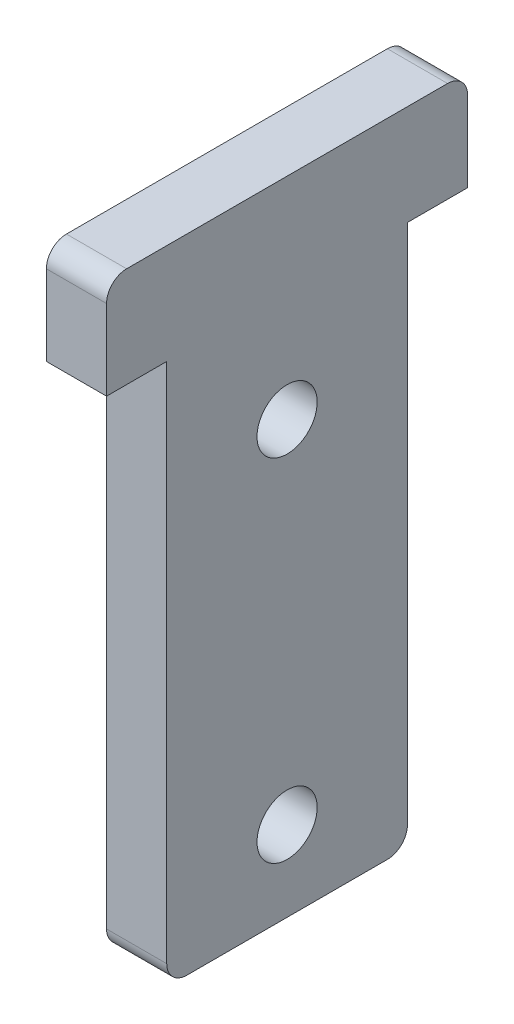
ISO-10303-21;
HEADER;
FILE_DESCRIPTION(('STEP AP214'),'2;1');
FILE_NAME('part.step','',(''),(''),'','','');
FILE_SCHEMA(('AUTOMOTIVE_DESIGN { 1 0 10303 214 1 1 1 1 }'));
ENDSEC;
DATA;
#1=APPLICATION_CONTEXT('core data for automotive mechanical design processes');
#2=APPLICATION_PROTOCOL_DEFINITION('international standard','automotive_design',2000,#1);
#3=PRODUCT_CONTEXT('',#1,'mechanical');
#4=PRODUCT('Part','Part','',(#3));
#5=PRODUCT_RELATED_PRODUCT_CATEGORY('part','',(#4));
#6=PRODUCT_DEFINITION_FORMATION('','',#4);
#7=PRODUCT_DEFINITION_CONTEXT('part definition',#1,'design');
#8=PRODUCT_DEFINITION('design','',#6,#7);
#9=PRODUCT_DEFINITION_SHAPE('','',#8);
#10=(LENGTH_UNIT() NAMED_UNIT(*) SI_UNIT(.MILLI.,.METRE.));
#11=(NAMED_UNIT(*) PLANE_ANGLE_UNIT() SI_UNIT($,.RADIAN.));
#12=(NAMED_UNIT(*) SI_UNIT($,.STERADIAN.) SOLID_ANGLE_UNIT());
#13=UNCERTAINTY_MEASURE_WITH_UNIT(LENGTH_MEASURE(1.E-05),#10,'distance_accuracy_value','');
#14=(GEOMETRIC_REPRESENTATION_CONTEXT(3) GLOBAL_UNCERTAINTY_ASSIGNED_CONTEXT((#13)) GLOBAL_UNIT_ASSIGNED_CONTEXT((#10,
#11,#12)) REPRESENTATION_CONTEXT('',''));
#15=CARTESIAN_POINT('',(0.,0.,0.));
#16=DIRECTION('',(0.,0.,1.));
#17=DIRECTION('',(1.,0.,0.));
#18=AXIS2_PLACEMENT_3D('',#15,#16,#17);
#19=CARTESIAN_POINT('',(3.,-16.,9.));
#20=DIRECTION('',(0.,0.,-1.));
#21=DIRECTION('',(-1.,0.,0.));
#22=AXIS2_PLACEMENT_3D('',#19,#20,#21);
#23=PLANE('',#22);
#24=DIRECTION('',(1.,0.,0.));
#25=VECTOR('',#24,1.);
#26=CARTESIAN_POINT('',(0.,15.,9.));
#27=LINE('',#26,#25);
#28=CARTESIAN_POINT('',(0.,15.,9.));
#29=VERTEX_POINT('',#28);
#30=CARTESIAN_POINT('',(3.,15.,9.));
#31=VERTEX_POINT('',#30);
#32=EDGE_CURVE('E124',#29,#31,#27,.T.);
#33=ORIENTED_EDGE('',*,*,#32,.F.);
#34=DIRECTION('',(0.,-1.,0.));
#35=VECTOR('',#34,1.);
#36=CARTESIAN_POINT('',(0.,-16.,9.));
#37=LINE('',#36,#35);
#38=CARTESIAN_POINT('',(0.,11.,9.));
#39=VERTEX_POINT('',#38);
#40=EDGE_CURVE('E138',#29,#39,#37,.T.);
#41=ORIENTED_EDGE('',*,*,#40,.T.);
#42=DIRECTION('',(1.,0.,0.));
#43=VECTOR('',#42,1.);
#44=CARTESIAN_POINT('',(0.,11.,9.));
#45=LINE('',#44,#43);
#46=CARTESIAN_POINT('',(3.,11.,9.));
#47=VERTEX_POINT('',#46);
#48=EDGE_CURVE('E216',#39,#47,#45,.T.);
#49=ORIENTED_EDGE('',*,*,#48,.T.);
#50=DIRECTION('',(0.,-1.,0.));
#51=VECTOR('',#50,1.);
#52=CARTESIAN_POINT('',(3.,-16.,9.));
#53=LINE('',#52,#51);
#54=EDGE_CURVE('E140',#31,#47,#53,.T.);
#55=ORIENTED_EDGE('',*,*,#54,.F.);
#56=EDGE_LOOP('',(#33,#41,#49,#55));
#57=FACE_BOUND('',#56,.T.);
#58=ADVANCED_FACE('F32',(#57),#23,.F.);
#59=CARTESIAN_POINT('',(3.,-16.,-9.));
#60=DIRECTION('',(0.,1.,0.));
#61=DIRECTION('',(0.,0.,1.));
#62=AXIS2_PLACEMENT_3D('',#59,#60,#61);
#63=PLANE('',#62);
#64=DIRECTION('',(1.,0.,0.));
#65=VECTOR('',#64,1.);
#66=CARTESIAN_POINT('',(0.,-16.,4.99999999999999));
#67=LINE('',#66,#65);
#68=CARTESIAN_POINT('',(0.,-16.,4.99999999999999));
#69=VERTEX_POINT('',#68);
#70=CARTESIAN_POINT('',(3.,-16.,4.99999999999999));
#71=VERTEX_POINT('',#70);
#72=EDGE_CURVE('E218',#69,#71,#67,.T.);
#73=ORIENTED_EDGE('',*,*,#72,.F.);
#74=DIRECTION('',(0.,0.,-1.));
#75=VECTOR('',#74,1.);
#76=CARTESIAN_POINT('',(0.,-16.,-9.));
#77=LINE('',#76,#75);
#78=CARTESIAN_POINT('',(0.,-16.,-5.));
#79=VERTEX_POINT('',#78);
#80=EDGE_CURVE('E145',#69,#79,#77,.T.);
#81=ORIENTED_EDGE('',*,*,#80,.T.);
#82=DIRECTION('',(1.,0.,0.));
#83=VECTOR('',#82,1.);
#84=CARTESIAN_POINT('',(0.,-16.,-5.));
#85=LINE('',#84,#83);
#86=CARTESIAN_POINT('',(3.,-16.,-5.));
#87=VERTEX_POINT('',#86);
#88=EDGE_CURVE('E192',#79,#87,#85,.T.);
#89=ORIENTED_EDGE('',*,*,#88,.T.);
#90=DIRECTION('',(0.,0.,-1.));
#91=VECTOR('',#90,1.);
#92=CARTESIAN_POINT('',(3.,-16.,-9.));
#93=LINE('',#92,#91);
#94=EDGE_CURVE('E161',#71,#87,#93,.T.);
#95=ORIENTED_EDGE('',*,*,#94,.F.);
#96=EDGE_LOOP('',(#73,#81,#89,#95));
#97=FACE_BOUND('',#96,.T.);
#98=ADVANCED_FACE('F263',(#97),#63,.F.);
#99=CARTESIAN_POINT('',(3.,-16.,-9.));
#100=DIRECTION('',(0.,0.,1.));
#101=DIRECTION('',(1.,0.,0.));
#102=AXIS2_PLACEMENT_3D('',#99,#100,#101);
#103=PLANE('',#102);
#104=DIRECTION('',(1.,0.,0.));
#105=VECTOR('',#104,1.);
#106=CARTESIAN_POINT('',(0.,11.,-9.));
#107=LINE('',#106,#105);
#108=CARTESIAN_POINT('',(0.,11.,-9.));
#109=VERTEX_POINT('',#108);
#110=CARTESIAN_POINT('',(3.,11.,-9.));
#111=VERTEX_POINT('',#110);
#112=EDGE_CURVE('E177',#109,#111,#107,.T.);
#113=ORIENTED_EDGE('',*,*,#112,.F.);
#114=DIRECTION('',(0.,1.,0.));
#115=VECTOR('',#114,1.);
#116=CARTESIAN_POINT('',(0.,-16.,-9.));
#117=LINE('',#116,#115);
#118=CARTESIAN_POINT('',(0.,15.,-9.));
#119=VERTEX_POINT('',#118);
#120=EDGE_CURVE('E149',#109,#119,#117,.T.);
#121=ORIENTED_EDGE('',*,*,#120,.T.);
#122=DIRECTION('',(1.,0.,0.));
#123=VECTOR('',#122,1.);
#124=CARTESIAN_POINT('',(0.,15.,-9.));
#125=LINE('',#124,#123);
#126=CARTESIAN_POINT('',(3.,15.,-9.));
#127=VERTEX_POINT('',#126);
#128=EDGE_CURVE('E151',#119,#127,#125,.T.);
#129=ORIENTED_EDGE('',*,*,#128,.T.);
#130=DIRECTION('',(0.,1.,0.));
#131=VECTOR('',#130,1.);
#132=CARTESIAN_POINT('',(3.,-16.,-9.));
#133=LINE('',#132,#131);
#134=EDGE_CURVE('E40',#111,#127,#133,.T.);
#135=ORIENTED_EDGE('',*,*,#134,.F.);
#136=EDGE_LOOP('',(#113,#121,#129,#135));
#137=FACE_BOUND('',#136,.T.);
#138=ADVANCED_FACE('F176',(#137),#103,.F.);
#139=CARTESIAN_POINT('',(3.,16.,-9.));
#140=DIRECTION('',(0.,-1.,0.));
#141=DIRECTION('',(0.,0.,-1.));
#142=AXIS2_PLACEMENT_3D('',#139,#140,#141);
#143=PLANE('',#142);
#144=DIRECTION('',(0.,0.,1.));
#145=VECTOR('',#144,1.);
#146=CARTESIAN_POINT('',(0.,16.,-9.));
#147=LINE('',#146,#145);
#148=CARTESIAN_POINT('',(0.,16.,-7.99999999999999));
#149=VERTEX_POINT('',#148);
#150=CARTESIAN_POINT('',(0.,16.,7.99999999999999));
#151=VERTEX_POINT('',#150);
#152=EDGE_CURVE('E35',#149,#151,#147,.T.);
#153=ORIENTED_EDGE('',*,*,#152,.T.);
#154=DIRECTION('',(1.,0.,0.));
#155=VECTOR('',#154,1.);
#156=CARTESIAN_POINT('',(0.,16.,7.99999999999999));
#157=LINE('',#156,#155);
#158=CARTESIAN_POINT('',(3.,16.,7.99999999999999));
#159=VERTEX_POINT('',#158);
#160=EDGE_CURVE('E127',#151,#159,#157,.T.);
#161=ORIENTED_EDGE('',*,*,#160,.T.);
#162=DIRECTION('',(0.,0.,1.));
#163=VECTOR('',#162,1.);
#164=CARTESIAN_POINT('',(3.,16.,-9.));
#165=LINE('',#164,#163);
#166=CARTESIAN_POINT('',(3.,16.,-7.99999999999999));
#167=VERTEX_POINT('',#166);
#168=EDGE_CURVE('E11',#167,#159,#165,.T.);
#169=ORIENTED_EDGE('',*,*,#168,.F.);
#170=DIRECTION('',(1.,0.,0.));
#171=VECTOR('',#170,1.);
#172=CARTESIAN_POINT('',(0.,16.,-7.99999999999999));
#173=LINE('',#172,#171);
#174=EDGE_CURVE('E146',#149,#167,#173,.T.);
#175=ORIENTED_EDGE('',*,*,#174,.F.);
#176=EDGE_LOOP('',(#153,#161,#169,#175));
#177=FACE_BOUND('',#176,.T.);
#178=ADVANCED_FACE('F251',(#177),#143,.F.);
#179=CARTESIAN_POINT('',(3.,0.,0.));
#180=DIRECTION('',(1.,0.,0.));
#181=DIRECTION('',(0.,0.,-1.));
#182=AXIS2_PLACEMENT_3D('',#179,#180,#181);
#183=PLANE('',#182);
#184=CARTESIAN_POINT('',(3.,5.5,0.));
#185=DIRECTION('',(1.,0.,0.));
#186=DIRECTION('',(0.,0.,-1.));
#187=AXIS2_PLACEMENT_3D('',#184,#185,#186);
#188=CIRCLE('',#187,1.5);
#189=CARTESIAN_POINT('',(3.,5.5,-1.50000000000001));
#190=VERTEX_POINT('',#189);
#191=EDGE_CURVE('E184',#190,#190,#188,.T.);
#192=ORIENTED_EDGE('',*,*,#191,.F.);
#193=EDGE_LOOP('',(#192));
#194=FACE_BOUND('',#193,.T.);
#195=CARTESIAN_POINT('',(3.,-12.,0.));
#196=DIRECTION('',(1.,0.,0.));
#197=DIRECTION('',(0.,0.,-1.));
#198=AXIS2_PLACEMENT_3D('',#195,#196,#197);
#199=CIRCLE('',#198,1.5);
#200=CARTESIAN_POINT('',(3.,-12.,-1.5));
#201=VERTEX_POINT('',#200);
#202=EDGE_CURVE('E234',#201,#201,#199,.T.);
#203=ORIENTED_EDGE('',*,*,#202,.F.);
#204=EDGE_LOOP('',(#203));
#205=FACE_BOUND('',#204,.T.);
#206=ORIENTED_EDGE('',*,*,#168,.T.);
#207=CARTESIAN_POINT('',(3.,15.,8.));
#208=DIRECTION('',(1.,0.,0.));
#209=DIRECTION('',(0.,0.,-1.));
#210=AXIS2_PLACEMENT_3D('',#207,#208,#209);
#211=CIRCLE('',#210,0.999999999999999);
#212=EDGE_CURVE('E132',#159,#31,#211,.T.);
#213=ORIENTED_EDGE('',*,*,#212,.T.);
#214=ORIENTED_EDGE('',*,*,#54,.T.);
#215=DIRECTION('',(0.,0.,1.));
#216=VECTOR('',#215,1.);
#217=CARTESIAN_POINT('',(3.,11.,0.));
#218=LINE('',#217,#216);
#219=CARTESIAN_POINT('',(3.,11.,5.99999999999999));
#220=VERTEX_POINT('',#219);
#221=EDGE_CURVE('E220',#220,#47,#218,.T.);
#222=ORIENTED_EDGE('',*,*,#221,.F.);
#223=DIRECTION('',(0.,1.,0.));
#224=VECTOR('',#223,1.);
#225=CARTESIAN_POINT('',(3.,0.,5.99999999999999));
#226=LINE('',#225,#224);
#227=CARTESIAN_POINT('',(3.,-15.,5.99999999999999));
#228=VERTEX_POINT('',#227);
#229=EDGE_CURVE('E223',#228,#220,#226,.T.);
#230=ORIENTED_EDGE('',*,*,#229,.F.);
#231=CARTESIAN_POINT('',(3.,-15.,4.99999999999999));
#232=DIRECTION('',(1.,0.,0.));
#233=DIRECTION('',(0.,0.,-1.));
#234=AXIS2_PLACEMENT_3D('',#231,#232,#233);
#235=CIRCLE('',#234,1.);
#236=EDGE_CURVE('E201',#228,#71,#235,.T.);
#237=ORIENTED_EDGE('',*,*,#236,.T.);
#238=ORIENTED_EDGE('',*,*,#94,.T.);
#239=CARTESIAN_POINT('',(3.,-15.,-5.));
#240=DIRECTION('',(1.,0.,0.));
#241=DIRECTION('',(0.,0.,-1.));
#242=AXIS2_PLACEMENT_3D('',#239,#240,#241);
#243=CIRCLE('',#242,1.);
#244=CARTESIAN_POINT('',(3.,-15.,-6.));
#245=VERTEX_POINT('',#244);
#246=EDGE_CURVE('E191',#87,#245,#243,.T.);
#247=ORIENTED_EDGE('',*,*,#246,.T.);
#248=DIRECTION('',(0.,1.,0.));
#249=VECTOR('',#248,1.);
#250=CARTESIAN_POINT('',(3.,0.,-6.));
#251=LINE('',#250,#249);
#252=CARTESIAN_POINT('',(3.,11.,-6.));
#253=VERTEX_POINT('',#252);
#254=EDGE_CURVE('E202',#245,#253,#251,.T.);
#255=ORIENTED_EDGE('',*,*,#254,.T.);
#256=DIRECTION('',(0.,0.,-1.));
#257=VECTOR('',#256,1.);
#258=CARTESIAN_POINT('',(3.,11.,0.));
#259=LINE('',#258,#257);
#260=EDGE_CURVE('E175',#253,#111,#259,.T.);
#261=ORIENTED_EDGE('',*,*,#260,.T.);
#262=ORIENTED_EDGE('',*,*,#134,.T.);
#263=CARTESIAN_POINT('',(3.,15.,-8.));
#264=DIRECTION('',(1.,0.,0.));
#265=DIRECTION('',(0.,0.,-1.));
#266=AXIS2_PLACEMENT_3D('',#263,#264,#265);
#267=CIRCLE('',#266,0.999999999999999);
#268=EDGE_CURVE('E141',#127,#167,#267,.T.);
#269=ORIENTED_EDGE('',*,*,#268,.T.);
#270=EDGE_LOOP('',(#206,#213,#214,#222,#230,#237,#238,#247,#255,#261,#262,#269));
#271=FACE_BOUND('',#270,.T.);
#272=ADVANCED_FACE('F172',(#194,#205,#271),#183,.T.);
#273=CARTESIAN_POINT('',(0.,0.,0.));
#274=DIRECTION('',(1.,0.,0.));
#275=DIRECTION('',(0.,0.,-1.));
#276=AXIS2_PLACEMENT_3D('',#273,#274,#275);
#277=PLANE('',#276);
#278=CARTESIAN_POINT('',(0.,-12.,0.));
#279=DIRECTION('',(1.,0.,0.));
#280=DIRECTION('',(0.,0.,-1.));
#281=AXIS2_PLACEMENT_3D('',#278,#279,#280);
#282=CIRCLE('',#281,1.5);
#283=CARTESIAN_POINT('',(0.,-12.,-1.5));
#284=VERTEX_POINT('',#283);
#285=EDGE_CURVE('E188',#284,#284,#282,.T.);
#286=ORIENTED_EDGE('',*,*,#285,.T.);
#287=EDGE_LOOP('',(#286));
#288=FACE_BOUND('',#287,.T.);
#289=CARTESIAN_POINT('',(0.,5.5,0.));
#290=DIRECTION('',(1.,0.,0.));
#291=DIRECTION('',(0.,0.,-1.));
#292=AXIS2_PLACEMENT_3D('',#289,#290,#291);
#293=CIRCLE('',#292,1.5);
#294=CARTESIAN_POINT('',(0.,5.5,-1.50000000000001));
#295=VERTEX_POINT('',#294);
#296=EDGE_CURVE('E187',#295,#295,#293,.T.);
#297=ORIENTED_EDGE('',*,*,#296,.T.);
#298=EDGE_LOOP('',(#297));
#299=FACE_BOUND('',#298,.T.);
#300=CARTESIAN_POINT('',(0.,15.,8.));
#301=DIRECTION('',(1.,0.,0.));
#302=DIRECTION('',(0.,0.,-1.));
#303=AXIS2_PLACEMENT_3D('',#300,#301,#302);
#304=CIRCLE('',#303,0.999999999999999);
#305=EDGE_CURVE('E121',#151,#29,#304,.T.);
#306=ORIENTED_EDGE('',*,*,#305,.F.);
#307=ORIENTED_EDGE('',*,*,#152,.F.);
#308=CARTESIAN_POINT('',(0.,15.,-8.));
#309=DIRECTION('',(1.,0.,0.));
#310=DIRECTION('',(0.,0.,-1.));
#311=AXIS2_PLACEMENT_3D('',#308,#309,#310);
#312=CIRCLE('',#311,0.999999999999999);
#313=EDGE_CURVE('E180',#119,#149,#312,.T.);
#314=ORIENTED_EDGE('',*,*,#313,.F.);
#315=ORIENTED_EDGE('',*,*,#120,.F.);
#316=DIRECTION('',(0.,0.,-1.));
#317=VECTOR('',#316,1.);
#318=CARTESIAN_POINT('',(0.,11.,0.));
#319=LINE('',#318,#317);
#320=CARTESIAN_POINT('',(0.,11.,-6.));
#321=VERTEX_POINT('',#320);
#322=EDGE_CURVE('E209',#321,#109,#319,.T.);
#323=ORIENTED_EDGE('',*,*,#322,.F.);
#324=DIRECTION('',(0.,1.,0.));
#325=VECTOR('',#324,1.);
#326=CARTESIAN_POINT('',(0.,0.,-6.));
#327=LINE('',#326,#325);
#328=CARTESIAN_POINT('',(0.,-15.,-6.));
#329=VERTEX_POINT('',#328);
#330=EDGE_CURVE('E195',#329,#321,#327,.T.);
#331=ORIENTED_EDGE('',*,*,#330,.F.);
#332=CARTESIAN_POINT('',(0.,-15.,-5.));
#333=DIRECTION('',(1.,0.,0.));
#334=DIRECTION('',(0.,0.,-1.));
#335=AXIS2_PLACEMENT_3D('',#332,#333,#334);
#336=CIRCLE('',#335,1.);
#337=EDGE_CURVE('E204',#79,#329,#336,.T.);
#338=ORIENTED_EDGE('',*,*,#337,.F.);
#339=ORIENTED_EDGE('',*,*,#80,.F.);
#340=CARTESIAN_POINT('',(0.,-15.,4.99999999999999));
#341=DIRECTION('',(1.,0.,0.));
#342=DIRECTION('',(0.,0.,-1.));
#343=AXIS2_PLACEMENT_3D('',#340,#341,#342);
#344=CIRCLE('',#343,1.);
#345=CARTESIAN_POINT('',(0.,-15.,5.99999999999999));
#346=VERTEX_POINT('',#345);
#347=EDGE_CURVE('E222',#346,#69,#344,.T.);
#348=ORIENTED_EDGE('',*,*,#347,.F.);
#349=DIRECTION('',(0.,1.,0.));
#350=VECTOR('',#349,1.);
#351=CARTESIAN_POINT('',(0.,0.,5.99999999999999));
#352=LINE('',#351,#350);
#353=CARTESIAN_POINT('',(0.,11.,5.99999999999999));
#354=VERTEX_POINT('',#353);
#355=EDGE_CURVE('E229',#346,#354,#352,.T.);
#356=ORIENTED_EDGE('',*,*,#355,.T.);
#357=DIRECTION('',(0.,0.,1.));
#358=VECTOR('',#357,1.);
#359=CARTESIAN_POINT('',(0.,11.,0.));
#360=LINE('',#359,#358);
#361=EDGE_CURVE('E48',#354,#39,#360,.T.);
#362=ORIENTED_EDGE('',*,*,#361,.T.);
#363=ORIENTED_EDGE('',*,*,#40,.F.);
#364=EDGE_LOOP('',(#306,#307,#314,#315,#323,#331,#338,#339,#348,#356,#362,#363));
#365=FACE_BOUND('',#364,.T.);
#366=ADVANCED_FACE('F143',(#288,#299,#365),#277,.F.);
#367=CARTESIAN_POINT('',(0.,15.,-8.));
#368=DIRECTION('',(1.,0.,0.));
#369=DIRECTION('',(0.,0.,-1.));
#370=AXIS2_PLACEMENT_3D('',#367,#368,#369);
#371=CYLINDRICAL_SURFACE('',#370,0.999999999999999);
#372=ORIENTED_EDGE('',*,*,#268,.F.);
#373=ORIENTED_EDGE('',*,*,#128,.F.);
#374=ORIENTED_EDGE('',*,*,#313,.T.);
#375=ORIENTED_EDGE('',*,*,#174,.T.);
#376=EDGE_LOOP('',(#372,#373,#374,#375));
#377=FACE_BOUND('',#376,.T.);
#378=ADVANCED_FACE('F246',(#377),#371,.T.);
#379=CARTESIAN_POINT('',(0.,-12.,0.));
#380=DIRECTION('',(1.,0.,0.));
#381=DIRECTION('',(0.,0.,-1.));
#382=AXIS2_PLACEMENT_3D('',#379,#380,#381);
#383=CYLINDRICAL_SURFACE('',#382,1.5);
#384=ORIENTED_EDGE('',*,*,#285,.F.);
#385=EDGE_LOOP('',(#384));
#386=FACE_BOUND('',#385,.T.);
#387=ORIENTED_EDGE('',*,*,#202,.T.);
#388=EDGE_LOOP('',(#387));
#389=FACE_BOUND('',#388,.T.);
#390=ADVANCED_FACE('F242',(#386,#389),#383,.F.);
#391=CARTESIAN_POINT('',(0.,5.5,0.));
#392=DIRECTION('',(1.,0.,0.));
#393=DIRECTION('',(0.,0.,-1.));
#394=AXIS2_PLACEMENT_3D('',#391,#392,#393);
#395=CYLINDRICAL_SURFACE('',#394,1.5);
#396=ORIENTED_EDGE('',*,*,#296,.F.);
#397=EDGE_LOOP('',(#396));
#398=FACE_BOUND('',#397,.T.);
#399=ORIENTED_EDGE('',*,*,#191,.T.);
#400=EDGE_LOOP('',(#399));
#401=FACE_BOUND('',#400,.T.);
#402=ADVANCED_FACE('F245',(#398,#401),#395,.F.);
#403=CARTESIAN_POINT('',(0.,-15.,-5.));
#404=DIRECTION('',(1.,0.,0.));
#405=DIRECTION('',(0.,0.,-1.));
#406=AXIS2_PLACEMENT_3D('',#403,#404,#405);
#407=CYLINDRICAL_SURFACE('',#406,1.);
#408=ORIENTED_EDGE('',*,*,#246,.F.);
#409=ORIENTED_EDGE('',*,*,#88,.F.);
#410=ORIENTED_EDGE('',*,*,#337,.T.);
#411=DIRECTION('',(1.,0.,0.));
#412=VECTOR('',#411,1.);
#413=CARTESIAN_POINT('',(0.,-15.,-6.));
#414=LINE('',#413,#412);
#415=EDGE_CURVE('E198',#329,#245,#414,.T.);
#416=ORIENTED_EDGE('',*,*,#415,.T.);
#417=EDGE_LOOP('',(#408,#409,#410,#416));
#418=FACE_BOUND('',#417,.T.);
#419=ADVANCED_FACE('F283',(#418),#407,.T.);
#420=CARTESIAN_POINT('',(0.,0.,-6.));
#421=DIRECTION('',(0.,0.,-1.));
#422=DIRECTION('',(0.,1.,0.));
#423=AXIS2_PLACEMENT_3D('',#420,#421,#422);
#424=PLANE('',#423);
#425=ORIENTED_EDGE('',*,*,#254,.F.);
#426=ORIENTED_EDGE('',*,*,#415,.F.);
#427=ORIENTED_EDGE('',*,*,#330,.T.);
#428=DIRECTION('',(1.,0.,0.));
#429=VECTOR('',#428,1.);
#430=CARTESIAN_POINT('',(0.,11.,-6.));
#431=LINE('',#430,#429);
#432=EDGE_CURVE('E56',#321,#253,#431,.T.);
#433=ORIENTED_EDGE('',*,*,#432,.T.);
#434=EDGE_LOOP('',(#425,#426,#427,#433));
#435=FACE_BOUND('',#434,.T.);
#436=ADVANCED_FACE('F285',(#435),#424,.T.);
#437=CARTESIAN_POINT('',(0.,11.,0.));
#438=DIRECTION('',(0.,-1.,0.));
#439=DIRECTION('',(0.,0.,-1.));
#440=AXIS2_PLACEMENT_3D('',#437,#438,#439);
#441=PLANE('',#440);
#442=ORIENTED_EDGE('',*,*,#260,.F.);
#443=ORIENTED_EDGE('',*,*,#432,.F.);
#444=ORIENTED_EDGE('',*,*,#322,.T.);
#445=ORIENTED_EDGE('',*,*,#112,.T.);
#446=EDGE_LOOP('',(#442,#443,#444,#445));
#447=FACE_BOUND('',#446,.T.);
#448=ADVANCED_FACE('F299',(#447),#441,.T.);
#449=CARTESIAN_POINT('',(0.,-15.,4.99999999999999));
#450=DIRECTION('',(1.,0.,0.));
#451=DIRECTION('',(0.,0.,-1.));
#452=AXIS2_PLACEMENT_3D('',#449,#450,#451);
#453=CYLINDRICAL_SURFACE('',#452,1.);
#454=ORIENTED_EDGE('',*,*,#236,.F.);
#455=DIRECTION('',(1.,0.,0.));
#456=VECTOR('',#455,1.);
#457=CARTESIAN_POINT('',(0.,-15.,5.99999999999999));
#458=LINE('',#457,#456);
#459=EDGE_CURVE('E212',#346,#228,#458,.T.);
#460=ORIENTED_EDGE('',*,*,#459,.F.);
#461=ORIENTED_EDGE('',*,*,#347,.T.);
#462=ORIENTED_EDGE('',*,*,#72,.T.);
#463=EDGE_LOOP('',(#454,#460,#461,#462));
#464=FACE_BOUND('',#463,.T.);
#465=ADVANCED_FACE('F287',(#464),#453,.T.);
#466=CARTESIAN_POINT('',(0.,11.,0.));
#467=DIRECTION('',(0.,1.,0.));
#468=DIRECTION('',(0.,0.,1.));
#469=AXIS2_PLACEMENT_3D('',#466,#467,#468);
#470=PLANE('',#469);
#471=ORIENTED_EDGE('',*,*,#221,.T.);
#472=ORIENTED_EDGE('',*,*,#48,.F.);
#473=ORIENTED_EDGE('',*,*,#361,.F.);
#474=DIRECTION('',(1.,0.,0.));
#475=VECTOR('',#474,1.);
#476=CARTESIAN_POINT('',(0.,11.,5.99999999999999));
#477=LINE('',#476,#475);
#478=EDGE_CURVE('E214',#354,#220,#477,.T.);
#479=ORIENTED_EDGE('',*,*,#478,.T.);
#480=EDGE_LOOP('',(#471,#472,#473,#479));
#481=FACE_BOUND('',#480,.T.);
#482=ADVANCED_FACE('F291',(#481),#470,.F.);
#483=CARTESIAN_POINT('',(0.,0.,5.99999999999999));
#484=DIRECTION('',(0.,0.,-1.));
#485=DIRECTION('',(-1.,0.,0.));
#486=AXIS2_PLACEMENT_3D('',#483,#484,#485);
#487=PLANE('',#486);
#488=ORIENTED_EDGE('',*,*,#229,.T.);
#489=ORIENTED_EDGE('',*,*,#478,.F.);
#490=ORIENTED_EDGE('',*,*,#355,.F.);
#491=ORIENTED_EDGE('',*,*,#459,.T.);
#492=EDGE_LOOP('',(#488,#489,#490,#491));
#493=FACE_BOUND('',#492,.T.);
#494=ADVANCED_FACE('F290',(#493),#487,.F.);
#495=CARTESIAN_POINT('',(0.,15.,8.));
#496=DIRECTION('',(1.,0.,0.));
#497=DIRECTION('',(0.,0.,-1.));
#498=AXIS2_PLACEMENT_3D('',#495,#496,#497);
#499=CYLINDRICAL_SURFACE('',#498,0.999999999999999);
#500=ORIENTED_EDGE('',*,*,#212,.F.);
#501=ORIENTED_EDGE('',*,*,#160,.F.);
#502=ORIENTED_EDGE('',*,*,#305,.T.);
#503=ORIENTED_EDGE('',*,*,#32,.T.);
#504=EDGE_LOOP('',(#500,#501,#502,#503));
#505=FACE_BOUND('',#504,.T.);
#506=ADVANCED_FACE('F123',(#505),#499,.T.);
#507=CLOSED_SHELL('',(#58,#98,#138,#178,#272,#366,#378,#390,#402,#419,#436,#448,#465,#482,#494,#506));
#508=MANIFOLD_SOLID_BREP('B2',#507);
#509=ADVANCED_BREP_SHAPE_REPRESENTATION('',(#18,#508),#14);
#510=SHAPE_DEFINITION_REPRESENTATION(#9,#509);
ENDSEC;
END-ISO-10303-21;
